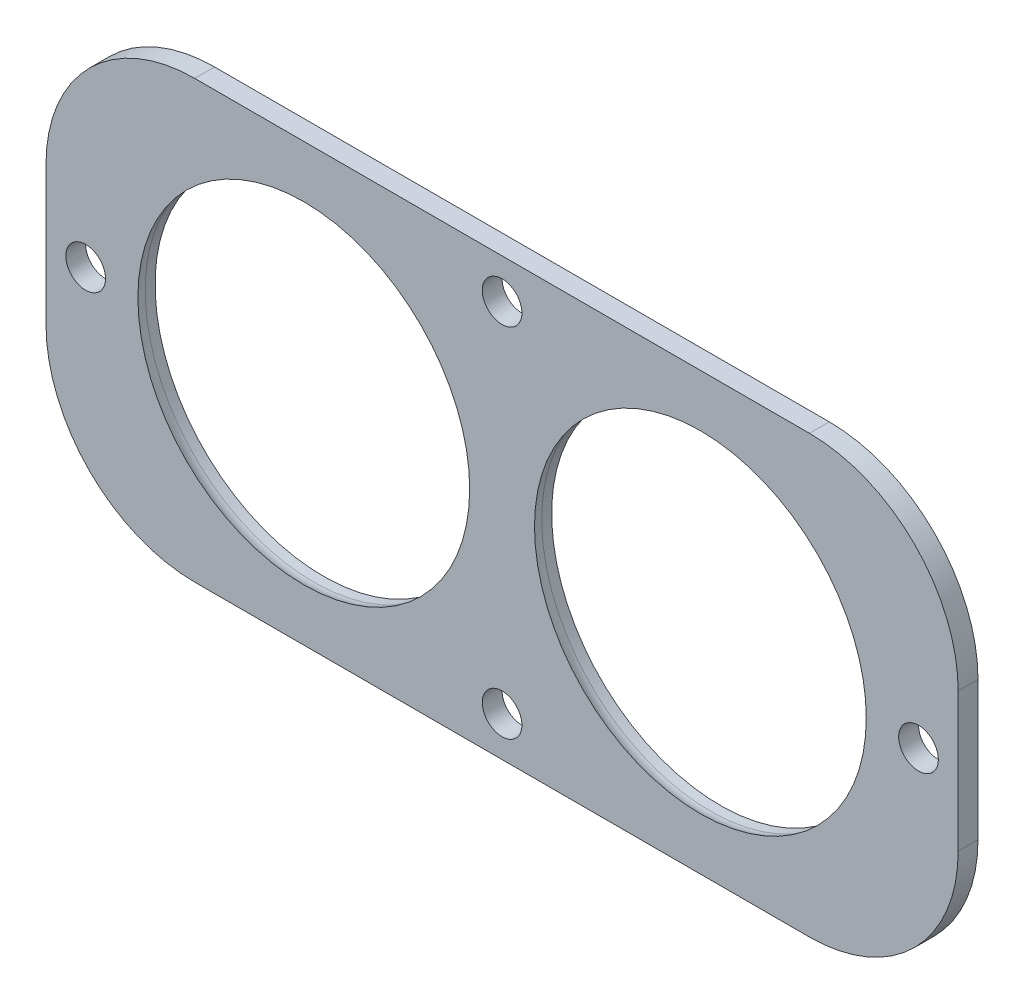
ISO-10303-21;
HEADER;
FILE_DESCRIPTION(('STEP AP214'),'2;1');
FILE_NAME('part.step','',(''),(''),'','','');
FILE_SCHEMA(('AUTOMOTIVE_DESIGN { 1 0 10303 214 1 1 1 1 }'));
ENDSEC;
DATA;
#1=APPLICATION_CONTEXT('core data for automotive mechanical design processes');
#2=APPLICATION_PROTOCOL_DEFINITION('international standard','automotive_design',2000,#1);
#3=PRODUCT_CONTEXT('',#1,'mechanical');
#4=PRODUCT('Part','Part','',(#3));
#5=PRODUCT_RELATED_PRODUCT_CATEGORY('part','',(#4));
#6=PRODUCT_DEFINITION_FORMATION('','',#4);
#7=PRODUCT_DEFINITION_CONTEXT('part definition',#1,'design');
#8=PRODUCT_DEFINITION('design','',#6,#7);
#9=PRODUCT_DEFINITION_SHAPE('','',#8);
#10=(LENGTH_UNIT() NAMED_UNIT(*) SI_UNIT(.MILLI.,.METRE.));
#11=(NAMED_UNIT(*) PLANE_ANGLE_UNIT() SI_UNIT($,.RADIAN.));
#12=(NAMED_UNIT(*) SI_UNIT($,.STERADIAN.) SOLID_ANGLE_UNIT());
#13=UNCERTAINTY_MEASURE_WITH_UNIT(LENGTH_MEASURE(1.E-05),#10,'distance_accuracy_value','');
#14=(GEOMETRIC_REPRESENTATION_CONTEXT(3) GLOBAL_UNCERTAINTY_ASSIGNED_CONTEXT((#13)) GLOBAL_UNIT_ASSIGNED_CONTEXT((#10,
#11,#12)) REPRESENTATION_CONTEXT('',''));
#15=CARTESIAN_POINT('',(0.,0.,0.));
#16=DIRECTION('',(0.,0.,1.));
#17=DIRECTION('',(1.,0.,0.));
#18=AXIS2_PLACEMENT_3D('',#15,#16,#17);
#19=CARTESIAN_POINT('',(-83.3769740312584,32.2039429696115,15.7909115225376));
#20=DIRECTION('',(1.,0.,0.));
#21=DIRECTION('',(0.,0.,-1.));
#22=AXIS2_PLACEMENT_3D('',#19,#20,#21);
#23=PLANE('',#22);
#24=DIRECTION('',(0.,1.,0.));
#25=VECTOR('',#24,1.);
#26=CARTESIAN_POINT('',(-83.3769740312584,32.2039429696115,14.7909115225376));
#27=LINE('',#26,#25);
#28=CARTESIAN_POINT('',(-83.3769740312584,3.20394296961147,14.7909115225376));
#29=VERTEX_POINT('',#28);
#30=CARTESIAN_POINT('',(-83.3769740312584,17.2039429696115,14.7909115225376));
#31=VERTEX_POINT('',#30);
#32=EDGE_CURVE('E52',#29,#31,#27,.T.);
#33=ORIENTED_EDGE('',*,*,#32,.T.);
#34=DIRECTION('',(0.,0.,-1.));
#35=VECTOR('',#34,1.);
#36=CARTESIAN_POINT('',(-83.3769740312584,17.2039429696115,15.7909115225376));
#37=LINE('',#36,#35);
#38=CARTESIAN_POINT('',(-83.3769740312584,17.2039429696115,12.7909115225376));
#39=VERTEX_POINT('',#38);
#40=EDGE_CURVE('E117',#31,#39,#37,.T.);
#41=ORIENTED_EDGE('',*,*,#40,.T.);
#42=DIRECTION('',(0.,-1.,0.));
#43=VECTOR('',#42,1.);
#44=CARTESIAN_POINT('',(-83.3769740312584,32.2039429696115,12.7909115225376));
#45=LINE('',#44,#43);
#46=CARTESIAN_POINT('',(-83.3769740312584,3.20394296961147,12.7909115225376));
#47=VERTEX_POINT('',#46);
#48=EDGE_CURVE('E159',#39,#47,#45,.T.);
#49=ORIENTED_EDGE('',*,*,#48,.T.);
#50=DIRECTION('',(0.,0.,-1.));
#51=VECTOR('',#50,1.);
#52=CARTESIAN_POINT('',(-83.3769740312584,3.20394296961147,15.7909115225376));
#53=LINE('',#52,#51);
#54=EDGE_CURVE('E120',#47,#29,#53,.F.);
#55=ORIENTED_EDGE('',*,*,#54,.T.);
#56=EDGE_LOOP('',(#33,#41,#49,#55));
#57=FACE_BOUND('',#56,.T.);
#58=ADVANCED_FACE('F36',(#57),#23,.F.);
#59=CARTESIAN_POINT('',(-83.3769740312584,-11.7960570303885,15.7909115225376));
#60=DIRECTION('',(0.,1.,0.));
#61=DIRECTION('',(0.,0.,1.));
#62=AXIS2_PLACEMENT_3D('',#59,#60,#61);
#63=PLANE('',#62);
#64=DIRECTION('',(-1.,0.,0.));
#65=VECTOR('',#64,1.);
#66=CARTESIAN_POINT('',(-83.3769740312584,-11.7960570303885,14.7909115225376));
#67=LINE('',#66,#65);
#68=CARTESIAN_POINT('',(-6.37697403125836,-11.7960570303885,14.7909115225376));
#69=VERTEX_POINT('',#68);
#70=CARTESIAN_POINT('',(-68.3769740312584,-11.7960570303885,14.7909115225376));
#71=VERTEX_POINT('',#70);
#72=EDGE_CURVE('E121',#69,#71,#67,.T.);
#73=ORIENTED_EDGE('',*,*,#72,.T.);
#74=DIRECTION('',(0.,0.,-1.));
#75=VECTOR('',#74,1.);
#76=CARTESIAN_POINT('',(-68.3769740312584,-11.7960570303885,15.7909115225376));
#77=LINE('',#76,#75);
#78=CARTESIAN_POINT('',(-68.3769740312584,-11.7960570303885,12.7909115225376));
#79=VERTEX_POINT('',#78);
#80=EDGE_CURVE('E134',#71,#79,#77,.T.);
#81=ORIENTED_EDGE('',*,*,#80,.T.);
#82=DIRECTION('',(1.,0.,0.));
#83=VECTOR('',#82,1.);
#84=CARTESIAN_POINT('',(-83.3769740312584,-11.7960570303885,12.7909115225376));
#85=LINE('',#84,#83);
#86=CARTESIAN_POINT('',(-6.37697403125836,-11.7960570303885,12.7909115225376));
#87=VERTEX_POINT('',#86);
#88=EDGE_CURVE('E157',#79,#87,#85,.T.);
#89=ORIENTED_EDGE('',*,*,#88,.T.);
#90=DIRECTION('',(0.,0.,-1.));
#91=VECTOR('',#90,1.);
#92=CARTESIAN_POINT('',(-6.37697403125836,-11.7960570303885,15.7909115225376));
#93=LINE('',#92,#91);
#94=EDGE_CURVE('E129',#87,#69,#93,.F.);
#95=ORIENTED_EDGE('',*,*,#94,.T.);
#96=EDGE_LOOP('',(#73,#81,#89,#95));
#97=FACE_BOUND('',#96,.T.);
#98=ADVANCED_FACE('F226',(#97),#63,.F.);
#99=CARTESIAN_POINT('',(8.62302596874163,32.2039429696115,15.7909115225376));
#100=DIRECTION('',(-1.,0.,0.));
#101=DIRECTION('',(0.,0.,1.));
#102=AXIS2_PLACEMENT_3D('',#99,#100,#101);
#103=PLANE('',#102);
#104=DIRECTION('',(0.,-1.,0.));
#105=VECTOR('',#104,1.);
#106=CARTESIAN_POINT('',(8.62302596874163,32.2039429696115,14.7909115225376));
#107=LINE('',#106,#105);
#108=CARTESIAN_POINT('',(8.62302596874163,17.2039429696115,14.7909115225376));
#109=VERTEX_POINT('',#108);
#110=CARTESIAN_POINT('',(8.62302596874163,3.20394296961147,14.7909115225376));
#111=VERTEX_POINT('',#110);
#112=EDGE_CURVE('E203',#109,#111,#107,.T.);
#113=ORIENTED_EDGE('',*,*,#112,.T.);
#114=DIRECTION('',(0.,0.,-1.));
#115=VECTOR('',#114,1.);
#116=CARTESIAN_POINT('',(8.62302596874163,3.20394296961147,15.7909115225376));
#117=LINE('',#116,#115);
#118=CARTESIAN_POINT('',(8.62302596874163,3.20394296961147,12.7909115225376));
#119=VERTEX_POINT('',#118);
#120=EDGE_CURVE('E139',#111,#119,#117,.T.);
#121=ORIENTED_EDGE('',*,*,#120,.T.);
#122=DIRECTION('',(0.,1.,0.));
#123=VECTOR('',#122,1.);
#124=CARTESIAN_POINT('',(8.62302596874163,32.2039429696115,12.7909115225376));
#125=LINE('',#124,#123);
#126=CARTESIAN_POINT('',(8.62302596874163,17.2039429696115,12.7909115225376));
#127=VERTEX_POINT('',#126);
#128=EDGE_CURVE('E154',#119,#127,#125,.T.);
#129=ORIENTED_EDGE('',*,*,#128,.T.);
#130=DIRECTION('',(0.,0.,-1.));
#131=VECTOR('',#130,1.);
#132=CARTESIAN_POINT('',(8.62302596874163,17.2039429696115,15.7909115225376));
#133=LINE('',#132,#131);
#134=EDGE_CURVE('E136',#127,#109,#133,.F.);
#135=ORIENTED_EDGE('',*,*,#134,.T.);
#136=EDGE_LOOP('',(#113,#121,#129,#135));
#137=FACE_BOUND('',#136,.T.);
#138=ADVANCED_FACE('F207',(#137),#103,.F.);
#139=CARTESIAN_POINT('',(-83.3769740312584,32.2039429696115,15.7909115225376));
#140=DIRECTION('',(0.,-1.,0.));
#141=DIRECTION('',(0.,0.,-1.));
#142=AXIS2_PLACEMENT_3D('',#139,#140,#141);
#143=PLANE('',#142);
#144=DIRECTION('',(1.,0.,0.));
#145=VECTOR('',#144,1.);
#146=CARTESIAN_POINT('',(-83.3769740312584,32.2039429696115,14.7909115225376));
#147=LINE('',#146,#145);
#148=CARTESIAN_POINT('',(-68.3769740312584,32.2039429696115,14.7909115225376));
#149=VERTEX_POINT('',#148);
#150=CARTESIAN_POINT('',(-6.37697403125836,32.2039429696115,14.7909115225376));
#151=VERTEX_POINT('',#150);
#152=EDGE_CURVE('E106',#149,#151,#147,.T.);
#153=ORIENTED_EDGE('',*,*,#152,.T.);
#154=DIRECTION('',(0.,0.,-1.));
#155=VECTOR('',#154,1.);
#156=CARTESIAN_POINT('',(-6.37697403125836,32.2039429696115,15.7909115225376));
#157=LINE('',#156,#155);
#158=CARTESIAN_POINT('',(-6.37697403125836,32.2039429696115,12.7909115225376));
#159=VERTEX_POINT('',#158);
#160=EDGE_CURVE('E147',#151,#159,#157,.T.);
#161=ORIENTED_EDGE('',*,*,#160,.T.);
#162=DIRECTION('',(-1.,0.,0.));
#163=VECTOR('',#162,1.);
#164=CARTESIAN_POINT('',(-83.3769740312584,32.2039429696115,12.7909115225376));
#165=LINE('',#164,#163);
#166=CARTESIAN_POINT('',(-68.3769740312584,32.2039429696115,12.7909115225376));
#167=VERTEX_POINT('',#166);
#168=EDGE_CURVE('E151',#159,#167,#165,.T.);
#169=ORIENTED_EDGE('',*,*,#168,.T.);
#170=DIRECTION('',(0.,0.,-1.));
#171=VECTOR('',#170,1.);
#172=CARTESIAN_POINT('',(-68.3769740312584,32.2039429696115,15.7909115225376));
#173=LINE('',#172,#171);
#174=EDGE_CURVE('E149',#167,#149,#173,.F.);
#175=ORIENTED_EDGE('',*,*,#174,.T.);
#176=EDGE_LOOP('',(#153,#161,#169,#175));
#177=FACE_BOUND('',#176,.T.);
#178=ADVANCED_FACE('F220',(#177),#143,.F.);
#179=CARTESIAN_POINT('',(-6.37697403125836,17.2039429696115,15.7909115225376));
#180=DIRECTION('',(0.,0.,-1.));
#181=DIRECTION('',(-1.,0.,0.));
#182=AXIS2_PLACEMENT_3D('',#179,#180,#181);
#183=CYLINDRICAL_SURFACE('',#182,15.);
#184=ORIENTED_EDGE('',*,*,#160,.F.);
#185=CARTESIAN_POINT('',(-6.37697403125836,17.2039429696115,14.7909115225376));
#186=DIRECTION('',(0.,0.,1.));
#187=DIRECTION('',(1.,0.,0.));
#188=AXIS2_PLACEMENT_3D('',#185,#186,#187);
#189=CIRCLE('',#188,15.);
#190=EDGE_CURVE('E172',#151,#109,#189,.F.);
#191=ORIENTED_EDGE('',*,*,#190,.T.);
#192=ORIENTED_EDGE('',*,*,#134,.F.);
#193=CARTESIAN_POINT('',(-6.37697403125836,17.2039429696115,12.7909115225376));
#194=DIRECTION('',(0.,0.,1.));
#195=DIRECTION('',(1.,0.,0.));
#196=AXIS2_PLACEMENT_3D('',#193,#194,#195);
#197=CIRCLE('',#196,15.);
#198=EDGE_CURVE('E141',#159,#127,#197,.F.);
#199=ORIENTED_EDGE('',*,*,#198,.F.);
#200=EDGE_LOOP('',(#184,#191,#192,#199));
#201=FACE_BOUND('',#200,.T.);
#202=ADVANCED_FACE('F218',(#201),#183,.T.);
#203=CARTESIAN_POINT('',(-6.37697403125836,3.20394296961147,15.7909115225376));
#204=DIRECTION('',(0.,0.,-1.));
#205=DIRECTION('',(-1.,0.,0.));
#206=AXIS2_PLACEMENT_3D('',#203,#204,#205);
#207=CYLINDRICAL_SURFACE('',#206,15.);
#208=ORIENTED_EDGE('',*,*,#120,.F.);
#209=CARTESIAN_POINT('',(-6.37697403125836,3.20394296961147,14.7909115225376));
#210=DIRECTION('',(0.,0.,1.));
#211=DIRECTION('',(1.,0.,0.));
#212=AXIS2_PLACEMENT_3D('',#209,#210,#211);
#213=CIRCLE('',#212,15.);
#214=EDGE_CURVE('E111',#111,#69,#213,.F.);
#215=ORIENTED_EDGE('',*,*,#214,.T.);
#216=ORIENTED_EDGE('',*,*,#94,.F.);
#217=CARTESIAN_POINT('',(-6.37697403125836,3.20394296961147,12.7909115225376));
#218=DIRECTION('',(0.,0.,1.));
#219=DIRECTION('',(1.,0.,0.));
#220=AXIS2_PLACEMENT_3D('',#217,#218,#219);
#221=CIRCLE('',#220,15.);
#222=EDGE_CURVE('E60',#119,#87,#221,.F.);
#223=ORIENTED_EDGE('',*,*,#222,.F.);
#224=EDGE_LOOP('',(#208,#215,#216,#223));
#225=FACE_BOUND('',#224,.T.);
#226=ADVANCED_FACE('F210',(#225),#207,.T.);
#227=CARTESIAN_POINT('',(-68.3769740312584,17.2039429696115,15.7909115225376));
#228=DIRECTION('',(0.,0.,-1.));
#229=DIRECTION('',(-1.,0.,0.));
#230=AXIS2_PLACEMENT_3D('',#227,#228,#229);
#231=CYLINDRICAL_SURFACE('',#230,15.);
#232=ORIENTED_EDGE('',*,*,#40,.F.);
#233=CARTESIAN_POINT('',(-68.3769740312584,17.2039429696115,14.7909115225376));
#234=DIRECTION('',(0.,0.,1.));
#235=DIRECTION('',(1.,0.,0.));
#236=AXIS2_PLACEMENT_3D('',#233,#234,#235);
#237=CIRCLE('',#236,15.);
#238=EDGE_CURVE('E102',#31,#149,#237,.F.);
#239=ORIENTED_EDGE('',*,*,#238,.T.);
#240=ORIENTED_EDGE('',*,*,#174,.F.);
#241=CARTESIAN_POINT('',(-68.3769740312584,17.2039429696115,12.7909115225376));
#242=DIRECTION('',(0.,0.,1.));
#243=DIRECTION('',(1.,0.,0.));
#244=AXIS2_PLACEMENT_3D('',#241,#242,#243);
#245=CIRCLE('',#244,15.);
#246=EDGE_CURVE('E124',#39,#167,#245,.F.);
#247=ORIENTED_EDGE('',*,*,#246,.F.);
#248=EDGE_LOOP('',(#232,#239,#240,#247));
#249=FACE_BOUND('',#248,.T.);
#250=ADVANCED_FACE('F123',(#249),#231,.T.);
#251=CARTESIAN_POINT('',(-68.3769740312584,3.20394296961147,15.7909115225376));
#252=DIRECTION('',(0.,0.,-1.));
#253=DIRECTION('',(-1.,0.,0.));
#254=AXIS2_PLACEMENT_3D('',#251,#252,#253);
#255=CYLINDRICAL_SURFACE('',#254,15.);
#256=ORIENTED_EDGE('',*,*,#80,.F.);
#257=CARTESIAN_POINT('',(-68.3769740312584,3.20394296961147,14.7909115225376));
#258=DIRECTION('',(0.,0.,1.));
#259=DIRECTION('',(1.,0.,0.));
#260=AXIS2_PLACEMENT_3D('',#257,#258,#259);
#261=CIRCLE('',#260,15.);
#262=EDGE_CURVE('E112',#71,#29,#261,.F.);
#263=ORIENTED_EDGE('',*,*,#262,.T.);
#264=ORIENTED_EDGE('',*,*,#54,.F.);
#265=CARTESIAN_POINT('',(-68.3769740312584,3.20394296961147,12.7909115225376));
#266=DIRECTION('',(0.,0.,1.));
#267=DIRECTION('',(1.,0.,0.));
#268=AXIS2_PLACEMENT_3D('',#265,#266,#267);
#269=CIRCLE('',#268,15.);
#270=EDGE_CURVE('E145',#79,#47,#269,.F.);
#271=ORIENTED_EDGE('',*,*,#270,.F.);
#272=EDGE_LOOP('',(#256,#263,#264,#271));
#273=FACE_BOUND('',#272,.T.);
#274=ADVANCED_FACE('F224',(#273),#255,.T.);
#275=CARTESIAN_POINT('',(-17.3769740312584,10.2039429696115,13.7909115225376));
#276=DIRECTION('',(0.,0.,1.));
#277=DIRECTION('',(1.,0.,0.));
#278=AXIS2_PLACEMENT_3D('',#275,#276,#277);
#279=TOROIDAL_SURFACE('',#278,15.,2.);
#280=CARTESIAN_POINT('',(-17.3769740312584,10.2039429696115,13.7909115225376));
#281=DIRECTION('',(0.,0.,1.));
#282=DIRECTION('',(1.,0.,0.));
#283=AXIS2_PLACEMENT_3D('',#280,#281,#282);
#284=CIRCLE('',#283,17.);
#285=CARTESIAN_POINT('',(-0.376974031258359,10.2039429696115,13.7909115225376));
#286=VERTEX_POINT('',#285);
#287=EDGE_CURVE('E45',#286,#286,#284,.T.);
#288=ORIENTED_EDGE('',*,*,#287,.F.);
#289=EDGE_LOOP('',(#288));
#290=FACE_BOUND('',#289,.T.);
#291=CARTESIAN_POINT('',(-17.3769740312584,10.2039429696115,14.7909115225376));
#292=DIRECTION('',(0.,0.,1.));
#293=DIRECTION('',(1.,0.,0.));
#294=AXIS2_PLACEMENT_3D('',#291,#292,#293);
#295=CIRCLE('',#294,16.7320508075689);
#296=CARTESIAN_POINT('',(-0.644923223689482,10.2039429696115,14.7909115225376));
#297=VERTEX_POINT('',#296);
#298=EDGE_CURVE('E185',#297,#297,#295,.F.);
#299=ORIENTED_EDGE('',*,*,#298,.F.);
#300=EDGE_LOOP('',(#299));
#301=FACE_BOUND('',#300,.T.);
#302=ADVANCED_FACE('F244',(#290,#301),#279,.F.);
#303=CARTESIAN_POINT('',(-57.3769740312584,10.2039429696115,13.7909115225376));
#304=DIRECTION('',(0.,0.,1.));
#305=DIRECTION('',(1.,0.,0.));
#306=AXIS2_PLACEMENT_3D('',#303,#304,#305);
#307=TOROIDAL_SURFACE('',#306,15.,2.);
#308=CARTESIAN_POINT('',(-57.3769740312584,10.2039429696115,13.7909115225376));
#309=DIRECTION('',(0.,0.,1.));
#310=DIRECTION('',(1.,0.,0.));
#311=AXIS2_PLACEMENT_3D('',#308,#309,#310);
#312=CIRCLE('',#311,17.);
#313=CARTESIAN_POINT('',(-40.3769740312584,10.2039429696115,13.7909115225376));
#314=VERTEX_POINT('',#313);
#315=EDGE_CURVE('E12',#314,#314,#312,.T.);
#316=ORIENTED_EDGE('',*,*,#315,.F.);
#317=EDGE_LOOP('',(#316));
#318=FACE_BOUND('',#317,.T.);
#319=CARTESIAN_POINT('',(-57.3769740312584,10.2039429696115,14.7909115225376));
#320=DIRECTION('',(0.,0.,1.));
#321=DIRECTION('',(1.,0.,0.));
#322=AXIS2_PLACEMENT_3D('',#319,#320,#321);
#323=CIRCLE('',#322,16.7320508075689);
#324=CARTESIAN_POINT('',(-40.6449232236895,10.2039429696115,14.7909115225376));
#325=VERTEX_POINT('',#324);
#326=EDGE_CURVE('E188',#325,#325,#323,.F.);
#327=ORIENTED_EDGE('',*,*,#326,.F.);
#328=EDGE_LOOP('',(#327));
#329=FACE_BOUND('',#328,.T.);
#330=ADVANCED_FACE('F38',(#318,#329),#307,.F.);
#331=CARTESIAN_POINT('',(-79.3769740312584,10.2039429696115,12.7909115225376));
#332=DIRECTION('',(0.,0.,1.));
#333=DIRECTION('',(1.,0.,0.));
#334=AXIS2_PLACEMENT_3D('',#331,#332,#333);
#335=CYLINDRICAL_SURFACE('',#334,2.00000000000001);
#336=CARTESIAN_POINT('',(-79.3769740312584,10.2039429696115,12.7909115225376));
#337=DIRECTION('',(0.,0.,1.));
#338=DIRECTION('',(1.,0.,0.));
#339=AXIS2_PLACEMENT_3D('',#336,#337,#338);
#340=CIRCLE('',#339,2.00000000000001);
#341=CARTESIAN_POINT('',(-77.3769740312584,10.2039429696115,12.7909115225376));
#342=VERTEX_POINT('',#341);
#343=EDGE_CURVE('E168',#342,#342,#340,.T.);
#344=ORIENTED_EDGE('',*,*,#343,.F.);
#345=EDGE_LOOP('',(#344));
#346=FACE_BOUND('',#345,.T.);
#347=CARTESIAN_POINT('',(-79.3769740312584,10.2039429696115,14.7909115225376));
#348=DIRECTION('',(0.,0.,1.));
#349=DIRECTION('',(1.,0.,0.));
#350=AXIS2_PLACEMENT_3D('',#347,#348,#349);
#351=CIRCLE('',#350,2.00000000000001);
#352=CARTESIAN_POINT('',(-77.3769740312584,10.2039429696115,14.7909115225376));
#353=VERTEX_POINT('',#352);
#354=EDGE_CURVE('E191',#353,#353,#351,.F.);
#355=ORIENTED_EDGE('',*,*,#354,.F.);
#356=EDGE_LOOP('',(#355));
#357=FACE_BOUND('',#356,.T.);
#358=ADVANCED_FACE('F250',(#346,#357),#335,.F.);
#359=CARTESIAN_POINT('',(4.62302596874164,10.2039429696115,12.7909115225376));
#360=DIRECTION('',(0.,0.,1.));
#361=DIRECTION('',(1.,0.,0.));
#362=AXIS2_PLACEMENT_3D('',#359,#360,#361);
#363=CYLINDRICAL_SURFACE('',#362,2.00000000000001);
#364=CARTESIAN_POINT('',(4.62302596874164,10.2039429696115,12.7909115225376));
#365=DIRECTION('',(0.,0.,1.));
#366=DIRECTION('',(1.,0.,0.));
#367=AXIS2_PLACEMENT_3D('',#364,#365,#366);
#368=CIRCLE('',#367,2.00000000000001);
#369=CARTESIAN_POINT('',(6.62302596874165,10.2039429696115,12.7909115225376));
#370=VERTEX_POINT('',#369);
#371=EDGE_CURVE('E171',#370,#370,#368,.T.);
#372=ORIENTED_EDGE('',*,*,#371,.F.);
#373=EDGE_LOOP('',(#372));
#374=FACE_BOUND('',#373,.T.);
#375=CARTESIAN_POINT('',(4.62302596874164,10.2039429696115,14.7909115225376));
#376=DIRECTION('',(0.,0.,1.));
#377=DIRECTION('',(1.,0.,0.));
#378=AXIS2_PLACEMENT_3D('',#375,#376,#377);
#379=CIRCLE('',#378,2.00000000000001);
#380=CARTESIAN_POINT('',(6.62302596874165,10.2039429696115,14.7909115225376));
#381=VERTEX_POINT('',#380);
#382=EDGE_CURVE('E194',#381,#381,#379,.F.);
#383=ORIENTED_EDGE('',*,*,#382,.F.);
#384=EDGE_LOOP('',(#383));
#385=FACE_BOUND('',#384,.T.);
#386=ADVANCED_FACE('F273',(#374,#385),#363,.F.);
#387=CARTESIAN_POINT('',(-37.3769740312584,-7.79605703038853,12.7909115225376));
#388=DIRECTION('',(0.,0.,1.));
#389=DIRECTION('',(1.,0.,0.));
#390=AXIS2_PLACEMENT_3D('',#387,#388,#389);
#391=CYLINDRICAL_SURFACE('',#390,2.);
#392=CARTESIAN_POINT('',(-37.3769740312584,-7.79605703038853,12.7909115225376));
#393=DIRECTION('',(0.,0.,1.));
#394=DIRECTION('',(1.,0.,0.));
#395=AXIS2_PLACEMENT_3D('',#392,#393,#394);
#396=CIRCLE('',#395,2.);
#397=CARTESIAN_POINT('',(-35.3769740312584,-7.79605703038853,12.7909115225376));
#398=VERTEX_POINT('',#397);
#399=EDGE_CURVE('E175',#398,#398,#396,.T.);
#400=ORIENTED_EDGE('',*,*,#399,.F.);
#401=EDGE_LOOP('',(#400));
#402=FACE_BOUND('',#401,.T.);
#403=CARTESIAN_POINT('',(-37.3769740312584,-7.79605703038853,14.7909115225376));
#404=DIRECTION('',(0.,0.,1.));
#405=DIRECTION('',(1.,0.,0.));
#406=AXIS2_PLACEMENT_3D('',#403,#404,#405);
#407=CIRCLE('',#406,2.);
#408=CARTESIAN_POINT('',(-35.3769740312584,-7.79605703038853,14.7909115225376));
#409=VERTEX_POINT('',#408);
#410=EDGE_CURVE('E197',#409,#409,#407,.F.);
#411=ORIENTED_EDGE('',*,*,#410,.F.);
#412=EDGE_LOOP('',(#411));
#413=FACE_BOUND('',#412,.T.);
#414=ADVANCED_FACE('F269',(#402,#413),#391,.F.);
#415=CARTESIAN_POINT('',(-37.3769740312584,28.2039429696115,12.7909115225376));
#416=DIRECTION('',(0.,0.,1.));
#417=DIRECTION('',(1.,0.,0.));
#418=AXIS2_PLACEMENT_3D('',#415,#416,#417);
#419=CYLINDRICAL_SURFACE('',#418,2.);
#420=CARTESIAN_POINT('',(-37.3769740312584,28.2039429696115,12.7909115225376));
#421=DIRECTION('',(0.,0.,1.));
#422=DIRECTION('',(1.,0.,0.));
#423=AXIS2_PLACEMENT_3D('',#420,#421,#422);
#424=CIRCLE('',#423,2.);
#425=CARTESIAN_POINT('',(-35.3769740312584,28.2039429696115,12.7909115225376));
#426=VERTEX_POINT('',#425);
#427=EDGE_CURVE('E167',#426,#426,#424,.T.);
#428=ORIENTED_EDGE('',*,*,#427,.F.);
#429=EDGE_LOOP('',(#428));
#430=FACE_BOUND('',#429,.T.);
#431=CARTESIAN_POINT('',(-37.3769740312584,28.2039429696115,14.7909115225376));
#432=DIRECTION('',(0.,0.,1.));
#433=DIRECTION('',(1.,0.,0.));
#434=AXIS2_PLACEMENT_3D('',#431,#432,#433);
#435=CIRCLE('',#434,2.);
#436=CARTESIAN_POINT('',(-35.3769740312584,28.2039429696115,14.7909115225376));
#437=VERTEX_POINT('',#436);
#438=EDGE_CURVE('E40',#437,#437,#435,.F.);
#439=ORIENTED_EDGE('',*,*,#438,.F.);
#440=EDGE_LOOP('',(#439));
#441=FACE_BOUND('',#440,.T.);
#442=ADVANCED_FACE('F266',(#430,#441),#419,.F.);
#443=CARTESIAN_POINT('',(-37.3769740312584,10.2039429696115,12.7909115225376));
#444=DIRECTION('',(0.,0.,1.));
#445=DIRECTION('',(1.,0.,0.));
#446=AXIS2_PLACEMENT_3D('',#443,#444,#445);
#447=PLANE('',#446);
#448=ORIENTED_EDGE('',*,*,#427,.T.);
#449=EDGE_LOOP('',(#448));
#450=FACE_BOUND('',#449,.T.);
#451=ORIENTED_EDGE('',*,*,#399,.T.);
#452=EDGE_LOOP('',(#451));
#453=FACE_BOUND('',#452,.T.);
#454=ORIENTED_EDGE('',*,*,#371,.T.);
#455=EDGE_LOOP('',(#454));
#456=FACE_BOUND('',#455,.T.);
#457=ORIENTED_EDGE('',*,*,#343,.T.);
#458=EDGE_LOOP('',(#457));
#459=FACE_BOUND('',#458,.T.);
#460=ORIENTED_EDGE('',*,*,#168,.F.);
#461=ORIENTED_EDGE('',*,*,#198,.T.);
#462=ORIENTED_EDGE('',*,*,#128,.F.);
#463=ORIENTED_EDGE('',*,*,#222,.T.);
#464=ORIENTED_EDGE('',*,*,#88,.F.);
#465=ORIENTED_EDGE('',*,*,#270,.T.);
#466=ORIENTED_EDGE('',*,*,#48,.F.);
#467=ORIENTED_EDGE('',*,*,#246,.T.);
#468=EDGE_LOOP('',(#460,#461,#462,#463,#464,#465,#466,#467));
#469=FACE_BOUND('',#468,.T.);
#470=CARTESIAN_POINT('',(-17.3769740312584,10.2039429696115,12.7909115225376));
#471=DIRECTION('',(0.,0.,1.));
#472=DIRECTION('',(1.,0.,0.));
#473=AXIS2_PLACEMENT_3D('',#470,#471,#472);
#474=CIRCLE('',#473,17.);
#475=CARTESIAN_POINT('',(-0.376974031258359,10.2039429696115,12.7909115225376));
#476=VERTEX_POINT('',#475);
#477=EDGE_CURVE('E161',#476,#476,#474,.T.);
#478=ORIENTED_EDGE('',*,*,#477,.T.);
#479=EDGE_LOOP('',(#478));
#480=FACE_BOUND('',#479,.T.);
#481=CARTESIAN_POINT('',(-57.3769740312584,10.2039429696115,12.7909115225376));
#482=DIRECTION('',(0.,0.,1.));
#483=DIRECTION('',(1.,0.,0.));
#484=AXIS2_PLACEMENT_3D('',#481,#482,#483);
#485=CIRCLE('',#484,17.);
#486=CARTESIAN_POINT('',(-40.3769740312584,10.2039429696115,12.7909115225376));
#487=VERTEX_POINT('',#486);
#488=EDGE_CURVE('E164',#487,#487,#485,.T.);
#489=ORIENTED_EDGE('',*,*,#488,.T.);
#490=EDGE_LOOP('',(#489));
#491=FACE_BOUND('',#490,.T.);
#492=ADVANCED_FACE('F213',(#450,#453,#456,#459,#469,#480,#491),#447,.F.);
#493=CARTESIAN_POINT('',(-17.3769740312584,10.2039429696115,15.7909115225376));
#494=DIRECTION('',(0.,0.,-1.));
#495=DIRECTION('',(-1.,0.,0.));
#496=AXIS2_PLACEMENT_3D('',#493,#494,#495);
#497=CYLINDRICAL_SURFACE('',#496,17.);
#498=ORIENTED_EDGE('',*,*,#287,.T.);
#499=EDGE_LOOP('',(#498));
#500=FACE_BOUND('',#499,.T.);
#501=ORIENTED_EDGE('',*,*,#477,.F.);
#502=EDGE_LOOP('',(#501));
#503=FACE_BOUND('',#502,.T.);
#504=ADVANCED_FACE('F262',(#500,#503),#497,.F.);
#505=CARTESIAN_POINT('',(-57.3769740312584,10.2039429696115,15.7909115225376));
#506=DIRECTION('',(0.,0.,-1.));
#507=DIRECTION('',(-1.,0.,0.));
#508=AXIS2_PLACEMENT_3D('',#505,#506,#507);
#509=CYLINDRICAL_SURFACE('',#508,17.);
#510=ORIENTED_EDGE('',*,*,#315,.T.);
#511=EDGE_LOOP('',(#510));
#512=FACE_BOUND('',#511,.T.);
#513=ORIENTED_EDGE('',*,*,#488,.F.);
#514=EDGE_LOOP('',(#513));
#515=FACE_BOUND('',#514,.T.);
#516=ADVANCED_FACE('F257',(#512,#515),#509,.F.);
#517=CARTESIAN_POINT('',(-37.3769740312584,10.2039429696115,14.7909115225376));
#518=DIRECTION('',(0.,0.,1.));
#519=DIRECTION('',(1.,0.,0.));
#520=AXIS2_PLACEMENT_3D('',#517,#518,#519);
#521=PLANE('',#520);
#522=ORIENTED_EDGE('',*,*,#152,.F.);
#523=ORIENTED_EDGE('',*,*,#238,.F.);
#524=ORIENTED_EDGE('',*,*,#32,.F.);
#525=ORIENTED_EDGE('',*,*,#262,.F.);
#526=ORIENTED_EDGE('',*,*,#72,.F.);
#527=ORIENTED_EDGE('',*,*,#214,.F.);
#528=ORIENTED_EDGE('',*,*,#112,.F.);
#529=ORIENTED_EDGE('',*,*,#190,.F.);
#530=EDGE_LOOP('',(#522,#523,#524,#525,#526,#527,#528,#529));
#531=FACE_BOUND('',#530,.T.);
#532=ORIENTED_EDGE('',*,*,#438,.T.);
#533=EDGE_LOOP('',(#532));
#534=FACE_BOUND('',#533,.T.);
#535=ORIENTED_EDGE('',*,*,#410,.T.);
#536=EDGE_LOOP('',(#535));
#537=FACE_BOUND('',#536,.T.);
#538=ORIENTED_EDGE('',*,*,#382,.T.);
#539=EDGE_LOOP('',(#538));
#540=FACE_BOUND('',#539,.T.);
#541=ORIENTED_EDGE('',*,*,#354,.T.);
#542=EDGE_LOOP('',(#541));
#543=FACE_BOUND('',#542,.T.);
#544=ORIENTED_EDGE('',*,*,#326,.T.);
#545=EDGE_LOOP('',(#544));
#546=FACE_BOUND('',#545,.T.);
#547=ORIENTED_EDGE('',*,*,#298,.T.);
#548=EDGE_LOOP('',(#547));
#549=FACE_BOUND('',#548,.T.);
#550=ADVANCED_FACE('F103',(#531,#534,#537,#540,#543,#546,#549),#521,.T.);
#551=CLOSED_SHELL('',(#58,#98,#138,#178,#202,#226,#250,#274,#302,#330,#358,#386,#414,#442,#492,
#504,#516,#550));
#552=MANIFOLD_SOLID_BREP('B2',#551);
#553=ADVANCED_BREP_SHAPE_REPRESENTATION('',(#18,#552),#14);
#554=SHAPE_DEFINITION_REPRESENTATION(#9,#553);
ENDSEC;
END-ISO-10303-21;
